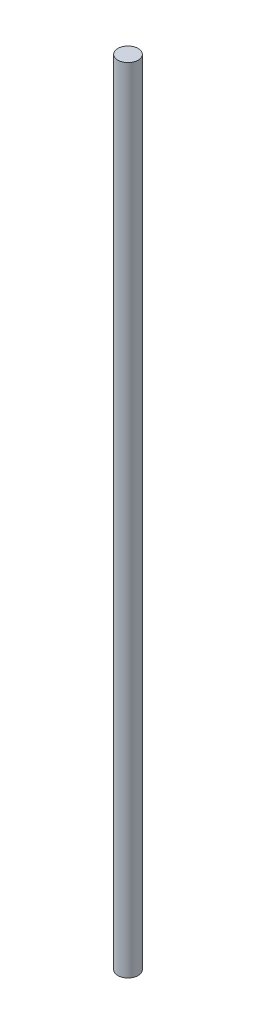
ISO-10303-21;
HEADER;
FILE_DESCRIPTION(('STEP AP214'),'2;1');
FILE_NAME('part.step','',(''),(''),'','','');
FILE_SCHEMA(('AUTOMOTIVE_DESIGN { 1 0 10303 214 1 1 1 1 }'));
ENDSEC;
DATA;
#1=APPLICATION_CONTEXT('core data for automotive mechanical design processes');
#2=APPLICATION_PROTOCOL_DEFINITION('international standard','automotive_design',2000,#1);
#3=PRODUCT_CONTEXT('',#1,'mechanical');
#4=PRODUCT('Part','Part','',(#3));
#5=PRODUCT_RELATED_PRODUCT_CATEGORY('part','',(#4));
#6=PRODUCT_DEFINITION_FORMATION('','',#4);
#7=PRODUCT_DEFINITION_CONTEXT('part definition',#1,'design');
#8=PRODUCT_DEFINITION('design','',#6,#7);
#9=PRODUCT_DEFINITION_SHAPE('','',#8);
#10=(LENGTH_UNIT() NAMED_UNIT(*) SI_UNIT(.MILLI.,.METRE.));
#11=(NAMED_UNIT(*) PLANE_ANGLE_UNIT() SI_UNIT($,.RADIAN.));
#12=(NAMED_UNIT(*) SI_UNIT($,.STERADIAN.) SOLID_ANGLE_UNIT());
#13=UNCERTAINTY_MEASURE_WITH_UNIT(LENGTH_MEASURE(1.E-05),#10,'distance_accuracy_value','');
#14=(GEOMETRIC_REPRESENTATION_CONTEXT(3) GLOBAL_UNCERTAINTY_ASSIGNED_CONTEXT((#13)) GLOBAL_UNIT_ASSIGNED_CONTEXT((#10,
#11,#12)) REPRESENTATION_CONTEXT('',''));
#15=CARTESIAN_POINT('',(0.,0.,0.));
#16=DIRECTION('',(0.,0.,1.));
#17=DIRECTION('',(1.,0.,0.));
#18=AXIS2_PLACEMENT_3D('',#15,#16,#17);
#19=CARTESIAN_POINT('',(0.,247.65,0.));
#20=DIRECTION('',(0.,1.,0.));
#21=DIRECTION('',(0.,0.,1.));
#22=AXIS2_PLACEMENT_3D('',#19,#20,#21);
#23=PLANE('',#22);
#24=CARTESIAN_POINT('',(0.,247.65,0.));
#25=DIRECTION('',(0.,-1.,0.));
#26=DIRECTION('',(0.,0.,-1.));
#27=AXIS2_PLACEMENT_3D('',#24,#25,#26);
#28=CIRCLE('',#27,3.175);
#29=CARTESIAN_POINT('',(0.,247.65,-3.175));
#30=VERTEX_POINT('',#29);
#31=EDGE_CURVE('E10',#30,#30,#28,.T.);
#32=ORIENTED_EDGE('',*,*,#31,.F.);
#33=EDGE_LOOP('',(#32));
#34=FACE_BOUND('',#33,.T.);
#35=ADVANCED_FACE('F31',(#34),#23,.T.);
#36=CARTESIAN_POINT('',(0.,0.,0.));
#37=DIRECTION('',(0.,-1.,0.));
#38=DIRECTION('',(0.,0.,-1.));
#39=AXIS2_PLACEMENT_3D('',#36,#37,#38);
#40=CYLINDRICAL_SURFACE('',#39,3.17500000000001);
#41=ORIENTED_EDGE('',*,*,#31,.T.);
#42=EDGE_LOOP('',(#41));
#43=FACE_BOUND('',#42,.T.);
#44=CARTESIAN_POINT('',(0.,0.,0.));
#45=DIRECTION('',(0.,-1.,0.));
#46=DIRECTION('',(0.,0.,-1.));
#47=AXIS2_PLACEMENT_3D('',#44,#45,#46);
#48=CIRCLE('',#47,3.17500000000003);
#49=CARTESIAN_POINT('',(0.,0.,-3.17500000000003));
#50=VERTEX_POINT('',#49);
#51=EDGE_CURVE('E37',#50,#50,#48,.T.);
#52=ORIENTED_EDGE('',*,*,#51,.F.);
#53=EDGE_LOOP('',(#52));
#54=FACE_BOUND('',#53,.T.);
#55=ADVANCED_FACE('F45',(#43,#54),#40,.T.);
#56=CARTESIAN_POINT('',(3.17500000000003,0.,0.));
#57=DIRECTION('',(0.,-1.,0.));
#58=DIRECTION('',(0.,0.,-1.));
#59=AXIS2_PLACEMENT_3D('',#56,#57,#58);
#60=PLANE('',#59);
#61=ORIENTED_EDGE('',*,*,#51,.T.);
#62=EDGE_LOOP('',(#61));
#63=FACE_BOUND('',#62,.T.);
#64=ADVANCED_FACE('F43',(#63),#60,.T.);
#65=CLOSED_SHELL('',(#35,#55,#64));
#66=MANIFOLD_SOLID_BREP('B2',#65);
#67=ADVANCED_BREP_SHAPE_REPRESENTATION('',(#18,#66),#14);
#68=SHAPE_DEFINITION_REPRESENTATION(#9,#67);
ENDSEC;
END-ISO-10303-21;
